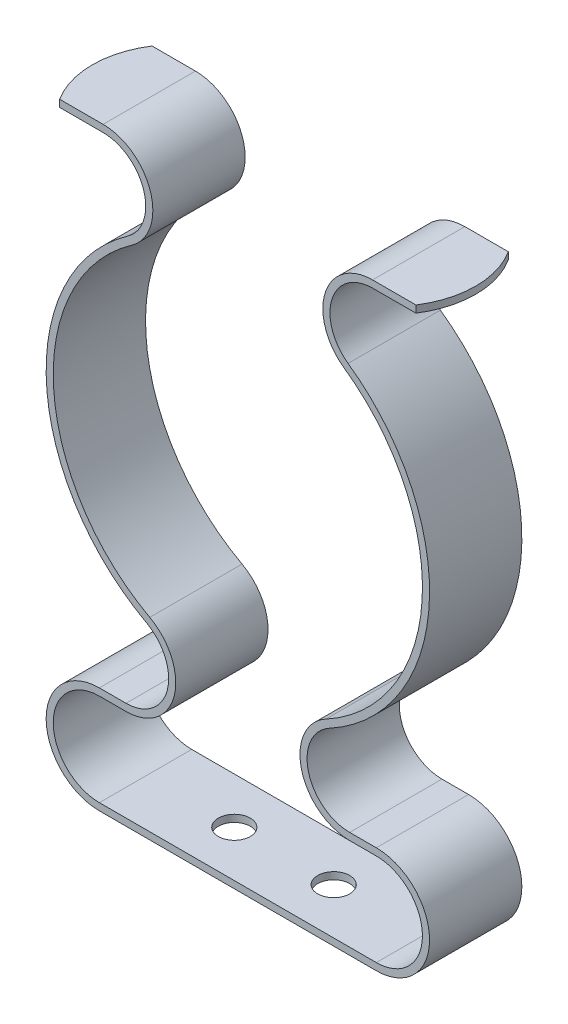
ISO-10303-21;
HEADER;
FILE_DESCRIPTION(('STEP AP214'),'2;1');
FILE_NAME('part.step','',(''),(''),'','','');
FILE_SCHEMA(('AUTOMOTIVE_DESIGN { 1 0 10303 214 1 1 1 1 }'));
ENDSEC;
DATA;
#1=APPLICATION_CONTEXT('core data for automotive mechanical design processes');
#2=APPLICATION_PROTOCOL_DEFINITION('international standard','automotive_design',2000,#1);
#3=PRODUCT_CONTEXT('',#1,'mechanical');
#4=PRODUCT('Part','Part','',(#3));
#5=PRODUCT_RELATED_PRODUCT_CATEGORY('part','',(#4));
#6=PRODUCT_DEFINITION_FORMATION('','',#4);
#7=PRODUCT_DEFINITION_CONTEXT('part definition',#1,'design');
#8=PRODUCT_DEFINITION('design','',#6,#7);
#9=PRODUCT_DEFINITION_SHAPE('','',#8);
#10=(LENGTH_UNIT() NAMED_UNIT(*) SI_UNIT(.MILLI.,.METRE.));
#11=(NAMED_UNIT(*) PLANE_ANGLE_UNIT() SI_UNIT($,.RADIAN.));
#12=(NAMED_UNIT(*) SI_UNIT($,.STERADIAN.) SOLID_ANGLE_UNIT());
#13=UNCERTAINTY_MEASURE_WITH_UNIT(LENGTH_MEASURE(1.E-05),#10,'distance_accuracy_value','');
#14=(GEOMETRIC_REPRESENTATION_CONTEXT(3) GLOBAL_UNCERTAINTY_ASSIGNED_CONTEXT((#13)) GLOBAL_UNIT_ASSIGNED_CONTEXT((#10,
#11,#12)) REPRESENTATION_CONTEXT('',''));
#15=CARTESIAN_POINT('',(0.,0.,0.));
#16=DIRECTION('',(0.,0.,1.));
#17=DIRECTION('',(1.,0.,0.));
#18=AXIS2_PLACEMENT_3D('',#15,#16,#17);
#19=CARTESIAN_POINT('',(-7.,-50.,0.));
#20=DIRECTION('',(0.,-1.,0.));
#21=DIRECTION('',(-1.,0.,0.));
#22=AXIS2_PLACEMENT_3D('',#19,#20,#21);
#23=CYLINDRICAL_SURFACE('',#22,2.25);
#24=CARTESIAN_POINT('',(-7.,-49.,0.));
#25=DIRECTION('',(0.,-1.,0.));
#26=DIRECTION('',(-1.,0.,0.));
#27=AXIS2_PLACEMENT_3D('',#24,#25,#26);
#28=CIRCLE('',#27,2.25);
#29=CARTESIAN_POINT('',(-4.75,-49.,0.));
#30=VERTEX_POINT('',#29);
#31=EDGE_CURVE('E34',#30,#30,#28,.T.);
#32=ORIENTED_EDGE('',*,*,#31,.F.);
#33=EDGE_LOOP('',(#32));
#34=FACE_BOUND('',#33,.T.);
#35=CARTESIAN_POINT('',(-7.,-50.,0.));
#36=DIRECTION('',(0.,1.,0.));
#37=DIRECTION('',(-1.,0.,0.));
#38=AXIS2_PLACEMENT_3D('',#35,#36,#37);
#39=CIRCLE('',#38,2.25);
#40=CARTESIAN_POINT('',(-4.75,-50.,0.));
#41=VERTEX_POINT('',#40);
#42=EDGE_CURVE('E266',#41,#41,#39,.T.);
#43=ORIENTED_EDGE('',*,*,#42,.F.);
#44=EDGE_LOOP('',(#43));
#45=FACE_BOUND('',#44,.T.);
#46=ADVANCED_FACE('F17',(#34,#45),#23,.F.);
#47=CARTESIAN_POINT('',(7.,-50.,0.));
#48=DIRECTION('',(0.,-1.,0.));
#49=DIRECTION('',(-1.,0.,0.));
#50=AXIS2_PLACEMENT_3D('',#47,#48,#49);
#51=CYLINDRICAL_SURFACE('',#50,2.25);
#52=CARTESIAN_POINT('',(7.,-49.,0.));
#53=DIRECTION('',(0.,-1.,0.));
#54=DIRECTION('',(-1.,0.,0.));
#55=AXIS2_PLACEMENT_3D('',#52,#53,#54);
#56=CIRCLE('',#55,2.25);
#57=CARTESIAN_POINT('',(9.25,-49.,0.));
#58=VERTEX_POINT('',#57);
#59=EDGE_CURVE('E351',#58,#58,#56,.T.);
#60=ORIENTED_EDGE('',*,*,#59,.F.);
#61=EDGE_LOOP('',(#60));
#62=FACE_BOUND('',#61,.T.);
#63=CARTESIAN_POINT('',(7.,-50.,0.));
#64=DIRECTION('',(0.,1.,0.));
#65=DIRECTION('',(-1.,0.,0.));
#66=AXIS2_PLACEMENT_3D('',#63,#64,#65);
#67=CIRCLE('',#66,2.25);
#68=CARTESIAN_POINT('',(9.25,-50.,0.));
#69=VERTEX_POINT('',#68);
#70=EDGE_CURVE('E263',#69,#69,#67,.T.);
#71=ORIENTED_EDGE('',*,*,#70,.F.);
#72=EDGE_LOOP('',(#71));
#73=FACE_BOUND('',#72,.T.);
#74=ADVANCED_FACE('F836',(#62,#73),#51,.F.);
#75=CARTESIAN_POINT('',(-15.,34.,0.));
#76=DIRECTION('',(0.,-1.,0.));
#77=DIRECTION('',(0.,0.,1.));
#78=AXIS2_PLACEMENT_3D('',#75,#76,#77);
#79=CYLINDRICAL_SURFACE('',#78,12.);
#80=DIRECTION('',(0.,1.,0.));
#81=VECTOR('',#80,1.);
#82=CARTESIAN_POINT('',(-25.087120500916,34.,-6.5));
#83=LINE('',#82,#81);
#84=CARTESIAN_POINT('',(-25.087120500916,33.,-6.5));
#85=VERTEX_POINT('',#84);
#86=CARTESIAN_POINT('',(-25.087120500916,34.,-6.5));
#87=VERTEX_POINT('',#86);
#88=EDGE_CURVE('E486',#85,#87,#83,.T.);
#89=ORIENTED_EDGE('',*,*,#88,.F.);
#90=CARTESIAN_POINT('',(-15.,33.,0.));
#91=DIRECTION('',(0.,-1.,0.));
#92=DIRECTION('',(0.,0.,1.));
#93=AXIS2_PLACEMENT_3D('',#90,#91,#92);
#94=CIRCLE('',#93,12.);
#95=CARTESIAN_POINT('',(-25.087120500916,33.,6.5));
#96=VERTEX_POINT('',#95);
#97=EDGE_CURVE('E389',#96,#85,#94,.T.);
#98=ORIENTED_EDGE('',*,*,#97,.F.);
#99=DIRECTION('',(0.,-1.,0.));
#100=VECTOR('',#99,1.);
#101=CARTESIAN_POINT('',(-25.087120500916,34.,6.5));
#102=LINE('',#101,#100);
#103=CARTESIAN_POINT('',(-25.087120500916,34.,6.5));
#104=VERTEX_POINT('',#103);
#105=EDGE_CURVE('E11',#104,#96,#102,.T.);
#106=ORIENTED_EDGE('',*,*,#105,.F.);
#107=CARTESIAN_POINT('',(-15.,34.,0.));
#108=DIRECTION('',(0.,1.,0.));
#109=DIRECTION('',(0.,0.,1.));
#110=AXIS2_PLACEMENT_3D('',#107,#108,#109);
#111=CIRCLE('',#110,12.);
#112=EDGE_CURVE('E230',#87,#104,#111,.T.);
#113=ORIENTED_EDGE('',*,*,#112,.F.);
#114=EDGE_LOOP('',(#89,#98,#106,#113));
#115=FACE_BOUND('',#114,.T.);
#116=ADVANCED_FACE('F606',(#115),#79,.T.);
#117=CARTESIAN_POINT('',(0.,-13.1659713817078,6.5));
#118=DIRECTION('',(0.,0.,1.));
#119=DIRECTION('',(1.,0.,0.));
#120=AXIS2_PLACEMENT_3D('',#117,#118,#119);
#121=PLANE('',#120);
#122=ORIENTED_EDGE('',*,*,#105,.T.);
#123=DIRECTION('',(-1.,0.,0.));
#124=VECTOR('',#123,1.);
#125=CARTESIAN_POINT('',(-27.1,33.,6.5));
#126=LINE('',#125,#124);
#127=CARTESIAN_POINT('',(-18.97366596101,33.,6.5));
#128=VERTEX_POINT('',#127);
#129=EDGE_CURVE('E427',#128,#96,#126,.T.);
#130=ORIENTED_EDGE('',*,*,#129,.F.);
#131=CARTESIAN_POINT('',(-18.9736659610105,27.,6.5));
#132=DIRECTION('',(0.,0.,1.));
#133=DIRECTION('',(-0.574959574576072,0.818181818181816,0.));
#134=AXIS2_PLACEMENT_3D('',#131,#132,#133);
#135=CIRCLE('',#134,6.);
#136=CARTESIAN_POINT('',(-15.523908513554,22.090909090909,6.5));
#137=VERTEX_POINT('',#136);
#138=EDGE_CURVE('E268',#137,#128,#135,.T.);
#139=ORIENTED_EDGE('',*,*,#138,.F.);
#140=CARTESIAN_POINT('',(6.99440505513849E-13,-1.35447209004269E-13,6.5));
#141=DIRECTION('',(0.,0.,-1.));
#142=DIRECTION('',(-0.574959574576089,0.818181818181804,0.));
#143=AXIS2_PLACEMENT_3D('',#140,#141,#142);
#144=CIRCLE('',#143,27.0000000000005);
#145=CARTESIAN_POINT('',(-12.884740157474,-23.727272727273,6.5));
#146=VERTEX_POINT('',#145);
#147=EDGE_CURVE('E293',#146,#137,#144,.T.);
#148=ORIENTED_EDGE('',*,*,#147,.F.);
#149=CARTESIAN_POINT('',(-15.7480157480234,-29.,6.5));
#150=DIRECTION('',(0.,0.,1.));
#151=DIRECTION('',(0.,1.,0.));
#152=AXIS2_PLACEMENT_3D('',#149,#150,#151);
#153=CIRCLE('',#152,5.9999999999998);
#154=CARTESIAN_POINT('',(-15.748015748024,-35.,6.5));
#155=VERTEX_POINT('',#154);
#156=EDGE_CURVE('E412',#155,#146,#153,.T.);
#157=ORIENTED_EDGE('',*,*,#156,.F.);
#158=DIRECTION('',(1.,0.,0.));
#159=VECTOR('',#158,1.);
#160=CARTESIAN_POINT('',(-15.748015748024,-35.,6.5));
#161=LINE('',#160,#159);
#162=CARTESIAN_POINT('',(-19.5,-35.,6.5));
#163=VERTEX_POINT('',#162);
#164=EDGE_CURVE('E262',#163,#155,#161,.T.);
#165=ORIENTED_EDGE('',*,*,#164,.F.);
#166=CARTESIAN_POINT('',(-19.5,-42.5,6.5));
#167=DIRECTION('',(0.,0.,-1.));
#168=DIRECTION('',(0.,1.,0.));
#169=AXIS2_PLACEMENT_3D('',#166,#167,#168);
#170=CIRCLE('',#169,7.5);
#171=CARTESIAN_POINT('',(-19.5,-50.,6.5));
#172=VERTEX_POINT('',#171);
#173=EDGE_CURVE('E307',#172,#163,#170,.T.);
#174=ORIENTED_EDGE('',*,*,#173,.F.);
#175=DIRECTION('',(-1.,0.,0.));
#176=VECTOR('',#175,1.);
#177=CARTESIAN_POINT('',(-19.5,-50.,6.5));
#178=LINE('',#177,#176);
#179=CARTESIAN_POINT('',(19.5,-50.,6.5));
#180=VERTEX_POINT('',#179);
#181=EDGE_CURVE('E267',#180,#172,#178,.T.);
#182=ORIENTED_EDGE('',*,*,#181,.F.);
#183=CARTESIAN_POINT('',(19.5,-42.5,6.5));
#184=DIRECTION('',(0.,0.,-1.));
#185=DIRECTION('',(0.,-1.,0.));
#186=AXIS2_PLACEMENT_3D('',#183,#184,#185);
#187=CIRCLE('',#186,7.5);
#188=CARTESIAN_POINT('',(19.5,-35.,6.5));
#189=VERTEX_POINT('',#188);
#190=EDGE_CURVE('E276',#189,#180,#187,.T.);
#191=ORIENTED_EDGE('',*,*,#190,.F.);
#192=DIRECTION('',(1.,0.,0.));
#193=VECTOR('',#192,1.);
#194=CARTESIAN_POINT('',(19.5,-35.,6.5));
#195=LINE('',#194,#193);
#196=CARTESIAN_POINT('',(15.748015748024,-35.,6.5));
#197=VERTEX_POINT('',#196);
#198=EDGE_CURVE('E283',#197,#189,#195,.T.);
#199=ORIENTED_EDGE('',*,*,#198,.F.);
#200=CARTESIAN_POINT('',(15.7480157480234,-29.,6.5));
#201=DIRECTION('',(0.,0.,1.));
#202=DIRECTION('',(0.477212598424925,-0.878787878787897,0.));
#203=AXIS2_PLACEMENT_3D('',#200,#201,#202);
#204=CIRCLE('',#203,5.9999999999998);
#205=CARTESIAN_POINT('',(12.884740157474,-23.727272727273,6.5));
#206=VERTEX_POINT('',#205);
#207=EDGE_CURVE('E310',#206,#197,#204,.T.);
#208=ORIENTED_EDGE('',*,*,#207,.F.);
#209=CARTESIAN_POINT('',(-7.01660951563099E-13,-1.33226762955019E-13,6.5));
#210=DIRECTION('',(0.,0.,-1.));
#211=DIRECTION('',(0.47721259842498,-0.878787878787867,0.));
#212=AXIS2_PLACEMENT_3D('',#209,#210,#211);
#213=CIRCLE('',#212,27.0000000000006);
#214=CARTESIAN_POINT('',(15.523908513554,22.090909090909,6.5));
#215=VERTEX_POINT('',#214);
#216=EDGE_CURVE('E314',#215,#206,#213,.T.);
#217=ORIENTED_EDGE('',*,*,#216,.F.);
#218=CARTESIAN_POINT('',(18.9736659610105,27.,6.5));
#219=DIRECTION('',(0.,0.,1.));
#220=DIRECTION('',(0.,-1.,0.));
#221=AXIS2_PLACEMENT_3D('',#218,#219,#220);
#222=CIRCLE('',#221,6.);
#223=CARTESIAN_POINT('',(18.97366596101,33.,6.5));
#224=VERTEX_POINT('',#223);
#225=EDGE_CURVE('E532',#224,#215,#222,.T.);
#226=ORIENTED_EDGE('',*,*,#225,.F.);
#227=DIRECTION('',(-1.,0.,0.));
#228=VECTOR('',#227,1.);
#229=CARTESIAN_POINT('',(18.97366596101,33.,6.5));
#230=LINE('',#229,#228);
#231=CARTESIAN_POINT('',(25.087120500916,33.,6.5));
#232=VERTEX_POINT('',#231);
#233=EDGE_CURVE('E437',#232,#224,#230,.T.);
#234=ORIENTED_EDGE('',*,*,#233,.F.);
#235=DIRECTION('',(0.,1.,0.));
#236=VECTOR('',#235,1.);
#237=CARTESIAN_POINT('',(25.087120500916,34.,6.5));
#238=LINE('',#237,#236);
#239=CARTESIAN_POINT('',(25.087120500916,34.,6.5));
#240=VERTEX_POINT('',#239);
#241=EDGE_CURVE('E27',#232,#240,#238,.T.);
#242=ORIENTED_EDGE('',*,*,#241,.T.);
#243=DIRECTION('',(1.,0.,0.));
#244=VECTOR('',#243,1.);
#245=CARTESIAN_POINT('',(27.1,34.,6.5));
#246=LINE('',#245,#244);
#247=CARTESIAN_POINT('',(18.97366596101,34.,6.5));
#248=VERTEX_POINT('',#247);
#249=EDGE_CURVE('E482',#248,#240,#246,.T.);
#250=ORIENTED_EDGE('',*,*,#249,.F.);
#251=CARTESIAN_POINT('',(18.9736659610103,27.,6.5));
#252=DIRECTION('',(0.,0.,-1.));
#253=DIRECTION('',(0.,1.,0.));
#254=AXIS2_PLACEMENT_3D('',#251,#252,#253);
#255=CIRCLE('',#254,7.);
#256=CARTESIAN_POINT('',(14.948948938978,21.272727272727,6.5));
#257=VERTEX_POINT('',#256);
#258=EDGE_CURVE('E301',#257,#248,#255,.T.);
#259=ORIENTED_EDGE('',*,*,#258,.F.);
#260=CARTESIAN_POINT('',(8.94839757847876E-13,-2.1316282072803E-13,6.5));
#261=DIRECTION('',(0.,0.,1.));
#262=DIRECTION('',(-0.477212598424935,0.878787878787891,0.));
#263=AXIS2_PLACEMENT_3D('',#260,#261,#262);
#264=CIRCLE('',#263,25.9999999999996);
#265=CARTESIAN_POINT('',(12.407527559049,-22.848484848485,6.5));
#266=VERTEX_POINT('',#265);
#267=EDGE_CURVE('E284',#266,#257,#264,.T.);
#268=ORIENTED_EDGE('',*,*,#267,.F.);
#269=CARTESIAN_POINT('',(15.7480157480234,-29.,6.5));
#270=DIRECTION('',(0.,0.,-1.));
#271=DIRECTION('',(-0.47721259842493,0.878787878787894,0.));
#272=AXIS2_PLACEMENT_3D('',#269,#270,#271);
#273=CIRCLE('',#272,6.99999999999986);
#274=CARTESIAN_POINT('',(15.748015748024,-36.,6.5));
#275=VERTEX_POINT('',#274);
#276=EDGE_CURVE('E256',#275,#266,#273,.T.);
#277=ORIENTED_EDGE('',*,*,#276,.F.);
#278=DIRECTION('',(-1.,0.,0.));
#279=VECTOR('',#278,1.);
#280=CARTESIAN_POINT('',(15.748015748024,-36.,6.5));
#281=LINE('',#280,#279);
#282=CARTESIAN_POINT('',(19.5,-36.,6.5));
#283=VERTEX_POINT('',#282);
#284=EDGE_CURVE('E366',#283,#275,#281,.T.);
#285=ORIENTED_EDGE('',*,*,#284,.F.);
#286=CARTESIAN_POINT('',(19.5,-42.5,6.5));
#287=DIRECTION('',(0.,0.,1.));
#288=DIRECTION('',(0.,1.,0.));
#289=AXIS2_PLACEMENT_3D('',#286,#287,#288);
#290=CIRCLE('',#289,6.5);
#291=CARTESIAN_POINT('',(19.5,-49.,6.5));
#292=VERTEX_POINT('',#291);
#293=EDGE_CURVE('E398',#292,#283,#290,.T.);
#294=ORIENTED_EDGE('',*,*,#293,.F.);
#295=DIRECTION('',(1.,0.,0.));
#296=VECTOR('',#295,1.);
#297=CARTESIAN_POINT('',(19.5,-49.,6.5));
#298=LINE('',#297,#296);
#299=CARTESIAN_POINT('',(-19.5,-49.,6.5));
#300=VERTEX_POINT('',#299);
#301=EDGE_CURVE('E347',#300,#292,#298,.T.);
#302=ORIENTED_EDGE('',*,*,#301,.F.);
#303=CARTESIAN_POINT('',(-19.5,-42.5,6.5));
#304=DIRECTION('',(0.,0.,1.));
#305=DIRECTION('',(0.,-1.,0.));
#306=AXIS2_PLACEMENT_3D('',#303,#304,#305);
#307=CIRCLE('',#306,6.5);
#308=CARTESIAN_POINT('',(-19.5,-36.,6.5));
#309=VERTEX_POINT('',#308);
#310=EDGE_CURVE('E341',#309,#300,#307,.T.);
#311=ORIENTED_EDGE('',*,*,#310,.F.);
#312=DIRECTION('',(-1.,0.,0.));
#313=VECTOR('',#312,1.);
#314=CARTESIAN_POINT('',(-19.5,-36.,6.5));
#315=LINE('',#314,#313);
#316=CARTESIAN_POINT('',(-15.748015748024,-36.,6.5));
#317=VERTEX_POINT('',#316);
#318=EDGE_CURVE('E329',#317,#309,#315,.T.);
#319=ORIENTED_EDGE('',*,*,#318,.F.);
#320=CARTESIAN_POINT('',(-15.7480157480234,-29.,6.5));
#321=DIRECTION('',(0.,0.,-1.));
#322=DIRECTION('',(0.,-1.,0.));
#323=AXIS2_PLACEMENT_3D('',#320,#321,#322);
#324=CIRCLE('',#323,6.99999999999986);
#325=CARTESIAN_POINT('',(-12.407527559049,-22.848484848485,6.5));
#326=VERTEX_POINT('',#325);
#327=EDGE_CURVE('E325',#326,#317,#324,.T.);
#328=ORIENTED_EDGE('',*,*,#327,.F.);
#329=CARTESIAN_POINT('',(-8.92619311798626E-13,-2.18713935851156E-13,6.5));
#330=DIRECTION('',(0.,0.,1.));
#331=DIRECTION('',(0.574959574576052,-0.81818181818183,0.));
#332=AXIS2_PLACEMENT_3D('',#329,#330,#331);
#333=CIRCLE('',#332,25.9999999999996);
#334=CARTESIAN_POINT('',(-14.948948938978,21.272727272727,6.5));
#335=VERTEX_POINT('',#334);
#336=EDGE_CURVE('E216',#335,#326,#333,.T.);
#337=ORIENTED_EDGE('',*,*,#336,.F.);
#338=CARTESIAN_POINT('',(-18.9736659610103,27.,6.5));
#339=DIRECTION('',(0.,0.,-1.));
#340=DIRECTION('',(0.574959574576038,-0.81818181818184,0.));
#341=AXIS2_PLACEMENT_3D('',#338,#339,#340);
#342=CIRCLE('',#341,7.);
#343=CARTESIAN_POINT('',(-18.97366596101,34.,6.5));
#344=VERTEX_POINT('',#343);
#345=EDGE_CURVE('E210',#344,#335,#342,.T.);
#346=ORIENTED_EDGE('',*,*,#345,.F.);
#347=DIRECTION('',(1.,0.,0.));
#348=VECTOR('',#347,1.);
#349=CARTESIAN_POINT('',(-18.97366596101,34.,6.5));
#350=LINE('',#349,#348);
#351=EDGE_CURVE('E213',#104,#344,#350,.T.);
#352=ORIENTED_EDGE('',*,*,#351,.F.);
#353=EDGE_LOOP('',(#122,#130,#139,#148,#157,#165,#174,#182,#191,#199,#208,#217,#226,#234,#242,
#250,#259,#268,#277,#285,#294,#302,#311,#319,#328,#337,#346,#352));
#354=FACE_BOUND('',#353,.T.);
#355=ADVANCED_FACE('F212',(#354),#121,.T.);
#356=CARTESIAN_POINT('',(-18.97366596101,33.,0.));
#357=DIRECTION('',(0.,-1.,0.));
#358=DIRECTION('',(0.,0.,-1.));
#359=AXIS2_PLACEMENT_3D('',#356,#357,#358);
#360=PLANE('',#359);
#361=ORIENTED_EDGE('',*,*,#97,.T.);
#362=DIRECTION('',(1.,0.,0.));
#363=VECTOR('',#362,1.);
#364=CARTESIAN_POINT('',(-27.1,33.,-6.5));
#365=LINE('',#364,#363);
#366=CARTESIAN_POINT('',(-18.97366596101,33.,-6.5));
#367=VERTEX_POINT('',#366);
#368=EDGE_CURVE('E385',#85,#367,#365,.T.);
#369=ORIENTED_EDGE('',*,*,#368,.T.);
#370=DIRECTION('',(0.,0.,1.));
#371=VECTOR('',#370,1.);
#372=CARTESIAN_POINT('',(-18.97366596101,33.,0.));
#373=LINE('',#372,#371);
#374=EDGE_CURVE('E390',#367,#128,#373,.T.);
#375=ORIENTED_EDGE('',*,*,#374,.T.);
#376=ORIENTED_EDGE('',*,*,#129,.T.);
#377=EDGE_LOOP('',(#361,#369,#375,#376));
#378=FACE_BOUND('',#377,.T.);
#379=ADVANCED_FACE('F608',(#378),#360,.T.);
#380=CARTESIAN_POINT('',(15.,34.,0.));
#381=DIRECTION('',(0.,-1.,0.));
#382=DIRECTION('',(0.,0.,-1.));
#383=AXIS2_PLACEMENT_3D('',#380,#381,#382);
#384=CYLINDRICAL_SURFACE('',#383,12.);
#385=DIRECTION('',(0.,-1.,0.));
#386=VECTOR('',#385,1.);
#387=CARTESIAN_POINT('',(25.087120500916,34.,-6.5));
#388=LINE('',#387,#386);
#389=CARTESIAN_POINT('',(25.087120500916,34.,-6.5));
#390=VERTEX_POINT('',#389);
#391=CARTESIAN_POINT('',(25.087120500916,33.,-6.5));
#392=VERTEX_POINT('',#391);
#393=EDGE_CURVE('E258',#390,#392,#388,.T.);
#394=ORIENTED_EDGE('',*,*,#393,.F.);
#395=CARTESIAN_POINT('',(15.,34.,0.));
#396=DIRECTION('',(0.,1.,0.));
#397=DIRECTION('',(0.,0.,-1.));
#398=AXIS2_PLACEMENT_3D('',#395,#396,#397);
#399=CIRCLE('',#398,12.);
#400=EDGE_CURVE('E364',#240,#390,#399,.T.);
#401=ORIENTED_EDGE('',*,*,#400,.F.);
#402=ORIENTED_EDGE('',*,*,#241,.F.);
#403=CARTESIAN_POINT('',(15.,33.,0.));
#404=DIRECTION('',(0.,-1.,0.));
#405=DIRECTION('',(0.,0.,-1.));
#406=AXIS2_PLACEMENT_3D('',#403,#404,#405);
#407=CIRCLE('',#406,12.);
#408=EDGE_CURVE('E359',#392,#232,#407,.T.);
#409=ORIENTED_EDGE('',*,*,#408,.F.);
#410=EDGE_LOOP('',(#394,#401,#402,#409));
#411=FACE_BOUND('',#410,.T.);
#412=ADVANCED_FACE('F564',(#411),#384,.T.);
#413=CARTESIAN_POINT('',(18.97366596101,34.,0.));
#414=DIRECTION('',(0.,1.,0.));
#415=DIRECTION('',(0.,0.,1.));
#416=AXIS2_PLACEMENT_3D('',#413,#414,#415);
#417=PLANE('',#416);
#418=ORIENTED_EDGE('',*,*,#400,.T.);
#419=DIRECTION('',(-1.,0.,0.));
#420=VECTOR('',#419,1.);
#421=CARTESIAN_POINT('',(27.1,34.,-6.5));
#422=LINE('',#421,#420);
#423=CARTESIAN_POINT('',(18.97366596101,34.,-6.5));
#424=VERTEX_POINT('',#423);
#425=EDGE_CURVE('E360',#390,#424,#422,.T.);
#426=ORIENTED_EDGE('',*,*,#425,.T.);
#427=DIRECTION('',(0.,0.,1.));
#428=VECTOR('',#427,1.);
#429=CARTESIAN_POINT('',(18.97366596101,34.,0.));
#430=LINE('',#429,#428);
#431=EDGE_CURVE('E365',#424,#248,#430,.T.);
#432=ORIENTED_EDGE('',*,*,#431,.T.);
#433=ORIENTED_EDGE('',*,*,#249,.T.);
#434=EDGE_LOOP('',(#418,#426,#432,#433));
#435=FACE_BOUND('',#434,.T.);
#436=ADVANCED_FACE('F567',(#435),#417,.T.);
#437=CARTESIAN_POINT('',(0.,-13.1659713817078,-6.5));
#438=DIRECTION('',(0.,0.,1.));
#439=DIRECTION('',(1.,0.,0.));
#440=AXIS2_PLACEMENT_3D('',#437,#438,#439);
#441=PLANE('',#440);
#442=ORIENTED_EDGE('',*,*,#88,.T.);
#443=DIRECTION('',(-1.,0.,0.));
#444=VECTOR('',#443,1.);
#445=CARTESIAN_POINT('',(-18.97366596101,34.,-6.5));
#446=LINE('',#445,#444);
#447=CARTESIAN_POINT('',(-18.97366596101,34.,-6.5));
#448=VERTEX_POINT('',#447);
#449=EDGE_CURVE('E222',#448,#87,#446,.T.);
#450=ORIENTED_EDGE('',*,*,#449,.F.);
#451=CARTESIAN_POINT('',(-18.9736659610103,27.,-6.5));
#452=DIRECTION('',(0.,0.,1.));
#453=DIRECTION('',(0.574959574576038,-0.81818181818184,0.));
#454=AXIS2_PLACEMENT_3D('',#451,#452,#453);
#455=CIRCLE('',#454,7.);
#456=CARTESIAN_POINT('',(-14.948948938978,21.272727272727,-6.5));
#457=VERTEX_POINT('',#456);
#458=EDGE_CURVE('E223',#457,#448,#455,.T.);
#459=ORIENTED_EDGE('',*,*,#458,.F.);
#460=CARTESIAN_POINT('',(-8.92619311798626E-13,-2.18713935851156E-13,-6.5));
#461=DIRECTION('',(0.,0.,-1.));
#462=DIRECTION('',(0.574959574576052,-0.81818181818183,0.));
#463=AXIS2_PLACEMENT_3D('',#460,#461,#462);
#464=CIRCLE('',#463,25.9999999999996);
#465=CARTESIAN_POINT('',(-12.407527559049,-22.848484848485,-6.5));
#466=VERTEX_POINT('',#465);
#467=EDGE_CURVE('E246',#466,#457,#464,.T.);
#468=ORIENTED_EDGE('',*,*,#467,.F.);
#469=CARTESIAN_POINT('',(-15.7480157480234,-29.,-6.5));
#470=DIRECTION('',(0.,0.,1.));
#471=DIRECTION('',(0.,-1.,0.));
#472=AXIS2_PLACEMENT_3D('',#469,#470,#471);
#473=CIRCLE('',#472,6.99999999999986);
#474=CARTESIAN_POINT('',(-15.748015748024,-36.,-6.5));
#475=VERTEX_POINT('',#474);
#476=EDGE_CURVE('E118',#475,#466,#473,.T.);
#477=ORIENTED_EDGE('',*,*,#476,.F.);
#478=DIRECTION('',(1.,0.,0.));
#479=VECTOR('',#478,1.);
#480=CARTESIAN_POINT('',(-19.5,-36.,-6.5));
#481=LINE('',#480,#479);
#482=CARTESIAN_POINT('',(-19.5,-36.,-6.5));
#483=VERTEX_POINT('',#482);
#484=EDGE_CURVE('E129',#483,#475,#481,.T.);
#485=ORIENTED_EDGE('',*,*,#484,.F.);
#486=CARTESIAN_POINT('',(-19.5,-42.5,-6.5));
#487=DIRECTION('',(0.,0.,-1.));
#488=DIRECTION('',(0.,-1.,0.));
#489=AXIS2_PLACEMENT_3D('',#486,#487,#488);
#490=CIRCLE('',#489,6.5);
#491=CARTESIAN_POINT('',(-19.5,-49.,-6.5));
#492=VERTEX_POINT('',#491);
#493=EDGE_CURVE('E338',#492,#483,#490,.T.);
#494=ORIENTED_EDGE('',*,*,#493,.F.);
#495=DIRECTION('',(-1.,0.,0.));
#496=VECTOR('',#495,1.);
#497=CARTESIAN_POINT('',(19.5,-49.,-6.5));
#498=LINE('',#497,#496);
#499=CARTESIAN_POINT('',(19.5,-49.,-6.5));
#500=VERTEX_POINT('',#499);
#501=EDGE_CURVE('E352',#500,#492,#498,.T.);
#502=ORIENTED_EDGE('',*,*,#501,.F.);
#503=CARTESIAN_POINT('',(19.5,-42.5,-6.5));
#504=DIRECTION('',(0.,0.,-1.));
#505=DIRECTION('',(0.,1.,0.));
#506=AXIS2_PLACEMENT_3D('',#503,#504,#505);
#507=CIRCLE('',#506,6.5);
#508=CARTESIAN_POINT('',(19.5,-36.,-6.5));
#509=VERTEX_POINT('',#508);
#510=EDGE_CURVE('E420',#509,#500,#507,.T.);
#511=ORIENTED_EDGE('',*,*,#510,.F.);
#512=DIRECTION('',(1.,0.,0.));
#513=VECTOR('',#512,1.);
#514=CARTESIAN_POINT('',(15.748015748024,-36.,-6.5));
#515=LINE('',#514,#513);
#516=CARTESIAN_POINT('',(15.748015748024,-36.,-6.5));
#517=VERTEX_POINT('',#516);
#518=EDGE_CURVE('E255',#517,#509,#515,.T.);
#519=ORIENTED_EDGE('',*,*,#518,.F.);
#520=CARTESIAN_POINT('',(15.7480157480234,-29.,-6.5));
#521=DIRECTION('',(0.,0.,1.));
#522=DIRECTION('',(-0.47721259842493,0.878787878787894,0.));
#523=AXIS2_PLACEMENT_3D('',#520,#521,#522);
#524=CIRCLE('',#523,6.99999999999986);
#525=CARTESIAN_POINT('',(12.407527559049,-22.848484848485,-6.5));
#526=VERTEX_POINT('',#525);
#527=EDGE_CURVE('E343',#526,#517,#524,.T.);
#528=ORIENTED_EDGE('',*,*,#527,.F.);
#529=CARTESIAN_POINT('',(8.94839757847876E-13,-2.1316282072803E-13,-6.5));
#530=DIRECTION('',(0.,0.,-1.));
#531=DIRECTION('',(-0.477212598424935,0.878787878787891,0.));
#532=AXIS2_PLACEMENT_3D('',#529,#530,#531);
#533=CIRCLE('',#532,25.9999999999996);
#534=CARTESIAN_POINT('',(14.948948938978,21.272727272727,-6.5));
#535=VERTEX_POINT('',#534);
#536=EDGE_CURVE('E289',#535,#526,#533,.T.);
#537=ORIENTED_EDGE('',*,*,#536,.F.);
#538=CARTESIAN_POINT('',(18.9736659610103,27.,-6.5));
#539=DIRECTION('',(0.,0.,1.));
#540=DIRECTION('',(0.,1.,0.));
#541=AXIS2_PLACEMENT_3D('',#538,#539,#540);
#542=CIRCLE('',#541,7.);
#543=EDGE_CURVE('E322',#424,#535,#542,.T.);
#544=ORIENTED_EDGE('',*,*,#543,.F.);
#545=ORIENTED_EDGE('',*,*,#425,.F.);
#546=ORIENTED_EDGE('',*,*,#393,.T.);
#547=DIRECTION('',(1.,0.,0.));
#548=VECTOR('',#547,1.);
#549=CARTESIAN_POINT('',(18.97366596101,33.,-6.5));
#550=LINE('',#549,#548);
#551=CARTESIAN_POINT('',(18.97366596101,33.,-6.5));
#552=VERTEX_POINT('',#551);
#553=EDGE_CURVE('E522',#552,#392,#550,.T.);
#554=ORIENTED_EDGE('',*,*,#553,.F.);
#555=CARTESIAN_POINT('',(18.9736659610105,27.,-6.5));
#556=DIRECTION('',(0.,0.,-1.));
#557=DIRECTION('',(0.,-1.,0.));
#558=AXIS2_PLACEMENT_3D('',#555,#556,#557);
#559=CIRCLE('',#558,6.);
#560=CARTESIAN_POINT('',(15.523908513554,22.090909090909,-6.5));
#561=VERTEX_POINT('',#560);
#562=EDGE_CURVE('E499',#561,#552,#559,.T.);
#563=ORIENTED_EDGE('',*,*,#562,.F.);
#564=CARTESIAN_POINT('',(-7.01660951563099E-13,-1.33226762955019E-13,-6.5));
#565=DIRECTION('',(0.,0.,1.));
#566=DIRECTION('',(0.47721259842498,-0.878787878787867,0.));
#567=AXIS2_PLACEMENT_3D('',#564,#565,#566);
#568=CIRCLE('',#567,27.0000000000006);
#569=CARTESIAN_POINT('',(12.884740157474,-23.727272727273,-6.5));
#570=VERTEX_POINT('',#569);
#571=EDGE_CURVE('E319',#570,#561,#568,.T.);
#572=ORIENTED_EDGE('',*,*,#571,.F.);
#573=CARTESIAN_POINT('',(15.7480157480234,-29.,-6.5));
#574=DIRECTION('',(0.,0.,-1.));
#575=DIRECTION('',(0.477212598424925,-0.878787878787897,0.));
#576=AXIS2_PLACEMENT_3D('',#573,#574,#575);
#577=CIRCLE('',#576,5.9999999999998);
#578=CARTESIAN_POINT('',(15.748015748024,-35.,-6.5));
#579=VERTEX_POINT('',#578);
#580=EDGE_CURVE('E282',#579,#570,#577,.T.);
#581=ORIENTED_EDGE('',*,*,#580,.F.);
#582=DIRECTION('',(-1.,0.,0.));
#583=VECTOR('',#582,1.);
#584=CARTESIAN_POINT('',(19.5,-35.,-6.5));
#585=LINE('',#584,#583);
#586=CARTESIAN_POINT('',(19.5,-35.,-6.5));
#587=VERTEX_POINT('',#586);
#588=EDGE_CURVE('E431',#587,#579,#585,.T.);
#589=ORIENTED_EDGE('',*,*,#588,.F.);
#590=CARTESIAN_POINT('',(19.5,-42.5,-6.5));
#591=DIRECTION('',(0.,0.,1.));
#592=DIRECTION('',(0.,-1.,0.));
#593=AXIS2_PLACEMENT_3D('',#590,#591,#592);
#594=CIRCLE('',#593,7.5);
#595=CARTESIAN_POINT('',(19.5,-50.,-6.5));
#596=VERTEX_POINT('',#595);
#597=EDGE_CURVE('E273',#596,#587,#594,.T.);
#598=ORIENTED_EDGE('',*,*,#597,.F.);
#599=DIRECTION('',(1.,0.,0.));
#600=VECTOR('',#599,1.);
#601=CARTESIAN_POINT('',(-19.5,-50.,-6.5));
#602=LINE('',#601,#600);
#603=CARTESIAN_POINT('',(-19.5,-50.,-6.5));
#604=VERTEX_POINT('',#603);
#605=EDGE_CURVE('E306',#604,#596,#602,.T.);
#606=ORIENTED_EDGE('',*,*,#605,.F.);
#607=CARTESIAN_POINT('',(-19.5,-42.5,-6.5));
#608=DIRECTION('',(0.,0.,1.));
#609=DIRECTION('',(0.,1.,0.));
#610=AXIS2_PLACEMENT_3D('',#607,#608,#609);
#611=CIRCLE('',#610,7.5);
#612=CARTESIAN_POINT('',(-19.5,-35.,-6.5));
#613=VERTEX_POINT('',#612);
#614=EDGE_CURVE('E375',#613,#604,#611,.T.);
#615=ORIENTED_EDGE('',*,*,#614,.F.);
#616=DIRECTION('',(-1.,0.,0.));
#617=VECTOR('',#616,1.);
#618=CARTESIAN_POINT('',(-15.748015748024,-35.,-6.5));
#619=LINE('',#618,#617);
#620=CARTESIAN_POINT('',(-15.748015748024,-35.,-6.5));
#621=VERTEX_POINT('',#620);
#622=EDGE_CURVE('E259',#621,#613,#619,.T.);
#623=ORIENTED_EDGE('',*,*,#622,.F.);
#624=CARTESIAN_POINT('',(-15.7480157480234,-29.,-6.5));
#625=DIRECTION('',(0.,0.,-1.));
#626=DIRECTION('',(0.,1.,0.));
#627=AXIS2_PLACEMENT_3D('',#624,#625,#626);
#628=CIRCLE('',#627,5.9999999999998);
#629=CARTESIAN_POINT('',(-12.884740157474,-23.727272727273,-6.5));
#630=VERTEX_POINT('',#629);
#631=EDGE_CURVE('E416',#630,#621,#628,.T.);
#632=ORIENTED_EDGE('',*,*,#631,.F.);
#633=CARTESIAN_POINT('',(6.99440505513849E-13,-1.35447209004269E-13,-6.5));
#634=DIRECTION('',(0.,0.,1.));
#635=DIRECTION('',(-0.574959574576089,0.818181818181804,0.));
#636=AXIS2_PLACEMENT_3D('',#633,#634,#635);
#637=CIRCLE('',#636,27.0000000000005);
#638=CARTESIAN_POINT('',(-15.523908513554,22.090909090909,-6.5));
#639=VERTEX_POINT('',#638);
#640=EDGE_CURVE('E290',#639,#630,#637,.T.);
#641=ORIENTED_EDGE('',*,*,#640,.F.);
#642=CARTESIAN_POINT('',(-18.9736659610105,27.,-6.5));
#643=DIRECTION('',(0.,0.,-1.));
#644=DIRECTION('',(-0.574959574576072,0.818181818181816,0.));
#645=AXIS2_PLACEMENT_3D('',#642,#643,#644);
#646=CIRCLE('',#645,6.);
#647=EDGE_CURVE('E272',#367,#639,#646,.T.);
#648=ORIENTED_EDGE('',*,*,#647,.F.);
#649=ORIENTED_EDGE('',*,*,#368,.F.);
#650=EDGE_LOOP('',(#442,#450,#459,#468,#477,#485,#494,#502,#511,#519,#528,#537,#544,#545,#546,
#554,#563,#572,#581,#589,#598,#606,#615,#623,#632,#641,#648,#649));
#651=FACE_BOUND('',#650,.T.);
#652=ADVANCED_FACE('F456',(#651),#441,.F.);
#653=CARTESIAN_POINT('',(-27.1,34.,0.));
#654=DIRECTION('',(0.,1.,0.));
#655=DIRECTION('',(0.,0.,1.));
#656=AXIS2_PLACEMENT_3D('',#653,#654,#655);
#657=PLANE('',#656);
#658=ORIENTED_EDGE('',*,*,#112,.T.);
#659=ORIENTED_EDGE('',*,*,#351,.T.);
#660=DIRECTION('',(0.,0.,1.));
#661=VECTOR('',#660,1.);
#662=CARTESIAN_POINT('',(-18.97366596101,34.,0.));
#663=LINE('',#662,#661);
#664=EDGE_CURVE('E229',#448,#344,#663,.T.);
#665=ORIENTED_EDGE('',*,*,#664,.F.);
#666=ORIENTED_EDGE('',*,*,#449,.T.);
#667=EDGE_LOOP('',(#658,#659,#665,#666));
#668=FACE_BOUND('',#667,.T.);
#669=ADVANCED_FACE('F227',(#668),#657,.T.);
#670=CARTESIAN_POINT('',(-18.9736659610103,27.,0.));
#671=DIRECTION('',(0.,0.,-1.));
#672=DIRECTION('',(0.574959574576038,-0.81818181818184,0.));
#673=AXIS2_PLACEMENT_3D('',#670,#671,#672);
#674=CYLINDRICAL_SURFACE('',#673,7.);
#675=ORIENTED_EDGE('',*,*,#345,.T.);
#676=DIRECTION('',(0.,0.,1.));
#677=VECTOR('',#676,1.);
#678=CARTESIAN_POINT('',(-14.948948938978,21.272727272727,0.));
#679=LINE('',#678,#677);
#680=EDGE_CURVE('E312',#457,#335,#679,.T.);
#681=ORIENTED_EDGE('',*,*,#680,.F.);
#682=ORIENTED_EDGE('',*,*,#458,.T.);
#683=ORIENTED_EDGE('',*,*,#664,.T.);
#684=EDGE_LOOP('',(#675,#681,#682,#683));
#685=FACE_BOUND('',#684,.T.);
#686=ADVANCED_FACE('F234',(#685),#674,.T.);
#687=CARTESIAN_POINT('',(-8.92619311798626E-13,-2.18713935851156E-13,0.));
#688=DIRECTION('',(0.,0.,-1.));
#689=DIRECTION('',(0.574959574576052,-0.81818181818183,0.));
#690=AXIS2_PLACEMENT_3D('',#687,#688,#689);
#691=CYLINDRICAL_SURFACE('',#690,25.9999999999996);
#692=ORIENTED_EDGE('',*,*,#336,.T.);
#693=DIRECTION('',(0.,0.,1.));
#694=VECTOR('',#693,1.);
#695=CARTESIAN_POINT('',(-12.407527559049,-22.848484848485,0.));
#696=LINE('',#695,#694);
#697=EDGE_CURVE('E326',#466,#326,#696,.T.);
#698=ORIENTED_EDGE('',*,*,#697,.F.);
#699=ORIENTED_EDGE('',*,*,#467,.T.);
#700=ORIENTED_EDGE('',*,*,#680,.T.);
#701=EDGE_LOOP('',(#692,#698,#699,#700));
#702=FACE_BOUND('',#701,.T.);
#703=ADVANCED_FACE('F19',(#702),#691,.F.);
#704=CARTESIAN_POINT('',(-15.7480157480234,-29.,0.));
#705=DIRECTION('',(0.,0.,-1.));
#706=DIRECTION('',(0.,-1.,0.));
#707=AXIS2_PLACEMENT_3D('',#704,#705,#706);
#708=CYLINDRICAL_SURFACE('',#707,6.99999999999986);
#709=ORIENTED_EDGE('',*,*,#327,.T.);
#710=DIRECTION('',(0.,0.,1.));
#711=VECTOR('',#710,1.);
#712=CARTESIAN_POINT('',(-15.748015748024,-36.,0.));
#713=LINE('',#712,#711);
#714=EDGE_CURVE('E250',#475,#317,#713,.T.);
#715=ORIENTED_EDGE('',*,*,#714,.F.);
#716=ORIENTED_EDGE('',*,*,#476,.T.);
#717=ORIENTED_EDGE('',*,*,#697,.T.);
#718=EDGE_LOOP('',(#709,#715,#716,#717));
#719=FACE_BOUND('',#718,.T.);
#720=ADVANCED_FACE('F600',(#719),#708,.T.);
#721=CARTESIAN_POINT('',(-15.748015748024,-36.,0.));
#722=DIRECTION('',(0.,-1.,0.));
#723=DIRECTION('',(0.,0.,-1.));
#724=AXIS2_PLACEMENT_3D('',#721,#722,#723);
#725=PLANE('',#724);
#726=ORIENTED_EDGE('',*,*,#318,.T.);
#727=DIRECTION('',(0.,0.,1.));
#728=VECTOR('',#727,1.);
#729=CARTESIAN_POINT('',(-19.5,-36.,0.));
#730=LINE('',#729,#728);
#731=EDGE_CURVE('E342',#483,#309,#730,.T.);
#732=ORIENTED_EDGE('',*,*,#731,.F.);
#733=ORIENTED_EDGE('',*,*,#484,.T.);
#734=ORIENTED_EDGE('',*,*,#714,.T.);
#735=EDGE_LOOP('',(#726,#732,#733,#734));
#736=FACE_BOUND('',#735,.T.);
#737=ADVANCED_FACE('F596',(#736),#725,.T.);
#738=CARTESIAN_POINT('',(-19.5,-42.5,0.));
#739=DIRECTION('',(0.,0.,-1.));
#740=DIRECTION('',(0.,-1.,0.));
#741=AXIS2_PLACEMENT_3D('',#738,#739,#740);
#742=CYLINDRICAL_SURFACE('',#741,6.5);
#743=ORIENTED_EDGE('',*,*,#310,.T.);
#744=DIRECTION('',(0.,0.,1.));
#745=VECTOR('',#744,1.);
#746=CARTESIAN_POINT('',(-19.5,-49.,0.));
#747=LINE('',#746,#745);
#748=EDGE_CURVE('E394',#492,#300,#747,.T.);
#749=ORIENTED_EDGE('',*,*,#748,.F.);
#750=ORIENTED_EDGE('',*,*,#493,.T.);
#751=ORIENTED_EDGE('',*,*,#731,.T.);
#752=EDGE_LOOP('',(#743,#749,#750,#751));
#753=FACE_BOUND('',#752,.T.);
#754=ADVANCED_FACE('F594',(#753),#742,.F.);
#755=CARTESIAN_POINT('',(-19.5,-49.,0.));
#756=DIRECTION('',(0.,1.,0.));
#757=DIRECTION('',(0.,0.,1.));
#758=AXIS2_PLACEMENT_3D('',#755,#756,#757);
#759=PLANE('',#758);
#760=ORIENTED_EDGE('',*,*,#31,.T.);
#761=EDGE_LOOP('',(#760));
#762=FACE_BOUND('',#761,.T.);
#763=ORIENTED_EDGE('',*,*,#59,.T.);
#764=EDGE_LOOP('',(#763));
#765=FACE_BOUND('',#764,.T.);
#766=ORIENTED_EDGE('',*,*,#301,.T.);
#767=DIRECTION('',(0.,0.,1.));
#768=VECTOR('',#767,1.);
#769=CARTESIAN_POINT('',(19.5,-49.,0.));
#770=LINE('',#769,#768);
#771=EDGE_CURVE('E370',#500,#292,#770,.T.);
#772=ORIENTED_EDGE('',*,*,#771,.F.);
#773=ORIENTED_EDGE('',*,*,#501,.T.);
#774=ORIENTED_EDGE('',*,*,#748,.T.);
#775=EDGE_LOOP('',(#766,#772,#773,#774));
#776=FACE_BOUND('',#775,.T.);
#777=ADVANCED_FACE('F590',(#762,#765,#776),#759,.T.);
#778=CARTESIAN_POINT('',(19.5,-42.5,0.));
#779=DIRECTION('',(0.,0.,-1.));
#780=DIRECTION('',(0.,1.,0.));
#781=AXIS2_PLACEMENT_3D('',#778,#779,#780);
#782=CYLINDRICAL_SURFACE('',#781,6.5);
#783=ORIENTED_EDGE('',*,*,#293,.T.);
#784=DIRECTION('',(0.,0.,1.));
#785=VECTOR('',#784,1.);
#786=CARTESIAN_POINT('',(19.5,-36.,0.));
#787=LINE('',#786,#785);
#788=EDGE_CURVE('E252',#509,#283,#787,.T.);
#789=ORIENTED_EDGE('',*,*,#788,.F.);
#790=ORIENTED_EDGE('',*,*,#510,.T.);
#791=ORIENTED_EDGE('',*,*,#771,.T.);
#792=EDGE_LOOP('',(#783,#789,#790,#791));
#793=FACE_BOUND('',#792,.T.);
#794=ADVANCED_FACE('F586',(#793),#782,.F.);
#795=CARTESIAN_POINT('',(19.5,-36.,0.));
#796=DIRECTION('',(0.,-1.,0.));
#797=DIRECTION('',(0.,0.,-1.));
#798=AXIS2_PLACEMENT_3D('',#795,#796,#797);
#799=PLANE('',#798);
#800=ORIENTED_EDGE('',*,*,#284,.T.);
#801=DIRECTION('',(0.,0.,1.));
#802=VECTOR('',#801,1.);
#803=CARTESIAN_POINT('',(15.748015748024,-36.,0.));
#804=LINE('',#803,#802);
#805=EDGE_CURVE('E288',#517,#275,#804,.T.);
#806=ORIENTED_EDGE('',*,*,#805,.F.);
#807=ORIENTED_EDGE('',*,*,#518,.T.);
#808=ORIENTED_EDGE('',*,*,#788,.T.);
#809=EDGE_LOOP('',(#800,#806,#807,#808));
#810=FACE_BOUND('',#809,.T.);
#811=ADVANCED_FACE('F582',(#810),#799,.T.);
#812=CARTESIAN_POINT('',(15.7480157480234,-29.,0.));
#813=DIRECTION('',(0.,0.,-1.));
#814=DIRECTION('',(-0.47721259842493,0.878787878787894,0.));
#815=AXIS2_PLACEMENT_3D('',#812,#813,#814);
#816=CYLINDRICAL_SURFACE('',#815,6.99999999999986);
#817=ORIENTED_EDGE('',*,*,#276,.T.);
#818=DIRECTION('',(0.,0.,1.));
#819=VECTOR('',#818,1.);
#820=CARTESIAN_POINT('',(12.407527559049,-22.848484848485,0.));
#821=LINE('',#820,#819);
#822=EDGE_CURVE('E297',#526,#266,#821,.T.);
#823=ORIENTED_EDGE('',*,*,#822,.F.);
#824=ORIENTED_EDGE('',*,*,#527,.T.);
#825=ORIENTED_EDGE('',*,*,#805,.T.);
#826=EDGE_LOOP('',(#817,#823,#824,#825));
#827=FACE_BOUND('',#826,.T.);
#828=ADVANCED_FACE('F578',(#827),#816,.T.);
#829=CARTESIAN_POINT('',(8.94839757847876E-13,-2.1316282072803E-13,0.));
#830=DIRECTION('',(0.,0.,-1.));
#831=DIRECTION('',(-0.477212598424935,0.878787878787891,0.));
#832=AXIS2_PLACEMENT_3D('',#829,#830,#831);
#833=CYLINDRICAL_SURFACE('',#832,25.9999999999996);
#834=ORIENTED_EDGE('',*,*,#267,.T.);
#835=DIRECTION('',(0.,0.,1.));
#836=VECTOR('',#835,1.);
#837=CARTESIAN_POINT('',(14.948948938978,21.272727272727,0.));
#838=LINE('',#837,#836);
#839=EDGE_CURVE('E355',#535,#257,#838,.T.);
#840=ORIENTED_EDGE('',*,*,#839,.F.);
#841=ORIENTED_EDGE('',*,*,#536,.T.);
#842=ORIENTED_EDGE('',*,*,#822,.T.);
#843=EDGE_LOOP('',(#834,#840,#841,#842));
#844=FACE_BOUND('',#843,.T.);
#845=ADVANCED_FACE('F575',(#844),#833,.F.);
#846=CARTESIAN_POINT('',(18.9736659610103,27.,0.));
#847=DIRECTION('',(0.,0.,-1.));
#848=DIRECTION('',(0.,1.,0.));
#849=AXIS2_PLACEMENT_3D('',#846,#847,#848);
#850=CYLINDRICAL_SURFACE('',#849,7.);
#851=ORIENTED_EDGE('',*,*,#258,.T.);
#852=ORIENTED_EDGE('',*,*,#431,.F.);
#853=ORIENTED_EDGE('',*,*,#543,.T.);
#854=ORIENTED_EDGE('',*,*,#839,.T.);
#855=EDGE_LOOP('',(#851,#852,#853,#854));
#856=FACE_BOUND('',#855,.T.);
#857=ADVANCED_FACE('F573',(#856),#850,.T.);
#858=CARTESIAN_POINT('',(27.1,33.,0.));
#859=DIRECTION('',(0.,-1.,0.));
#860=DIRECTION('',(0.,0.,-1.));
#861=AXIS2_PLACEMENT_3D('',#858,#859,#860);
#862=PLANE('',#861);
#863=ORIENTED_EDGE('',*,*,#408,.T.);
#864=ORIENTED_EDGE('',*,*,#233,.T.);
#865=DIRECTION('',(0.,0.,1.));
#866=VECTOR('',#865,1.);
#867=CARTESIAN_POINT('',(18.97366596101,33.,0.));
#868=LINE('',#867,#866);
#869=EDGE_CURVE('E318',#552,#224,#868,.T.);
#870=ORIENTED_EDGE('',*,*,#869,.F.);
#871=ORIENTED_EDGE('',*,*,#553,.T.);
#872=EDGE_LOOP('',(#863,#864,#870,#871));
#873=FACE_BOUND('',#872,.T.);
#874=ADVANCED_FACE('F557',(#873),#862,.T.);
#875=CARTESIAN_POINT('',(18.9736659610105,27.,0.));
#876=DIRECTION('',(0.,0.,-1.));
#877=DIRECTION('',(0.,-1.,0.));
#878=AXIS2_PLACEMENT_3D('',#875,#876,#877);
#879=CYLINDRICAL_SURFACE('',#878,6.);
#880=ORIENTED_EDGE('',*,*,#225,.T.);
#881=DIRECTION('',(0.,0.,1.));
#882=VECTOR('',#881,1.);
#883=CARTESIAN_POINT('',(15.523908513554,22.090909090909,0.));
#884=LINE('',#883,#882);
#885=EDGE_CURVE('E393',#561,#215,#884,.T.);
#886=ORIENTED_EDGE('',*,*,#885,.F.);
#887=ORIENTED_EDGE('',*,*,#562,.T.);
#888=ORIENTED_EDGE('',*,*,#869,.T.);
#889=EDGE_LOOP('',(#880,#886,#887,#888));
#890=FACE_BOUND('',#889,.T.);
#891=ADVANCED_FACE('F551',(#890),#879,.F.);
#892=CARTESIAN_POINT('',(-7.01660951563099E-13,-1.33226762955019E-13,0.));
#893=DIRECTION('',(0.,0.,-1.));
#894=DIRECTION('',(0.47721259842498,-0.878787878787867,0.));
#895=AXIS2_PLACEMENT_3D('',#892,#893,#894);
#896=CYLINDRICAL_SURFACE('',#895,27.0000000000006);
#897=ORIENTED_EDGE('',*,*,#216,.T.);
#898=DIRECTION('',(0.,0.,1.));
#899=VECTOR('',#898,1.);
#900=CARTESIAN_POINT('',(12.884740157474,-23.727272727273,0.));
#901=LINE('',#900,#899);
#902=EDGE_CURVE('E278',#570,#206,#901,.T.);
#903=ORIENTED_EDGE('',*,*,#902,.F.);
#904=ORIENTED_EDGE('',*,*,#571,.T.);
#905=ORIENTED_EDGE('',*,*,#885,.T.);
#906=EDGE_LOOP('',(#897,#903,#904,#905));
#907=FACE_BOUND('',#906,.T.);
#908=ADVANCED_FACE('F796',(#907),#896,.T.);
#909=CARTESIAN_POINT('',(15.7480157480234,-29.,0.));
#910=DIRECTION('',(0.,0.,-1.));
#911=DIRECTION('',(0.477212598424925,-0.878787878787897,0.));
#912=AXIS2_PLACEMENT_3D('',#909,#910,#911);
#913=CYLINDRICAL_SURFACE('',#912,5.9999999999998);
#914=ORIENTED_EDGE('',*,*,#207,.T.);
#915=DIRECTION('',(0.,0.,1.));
#916=VECTOR('',#915,1.);
#917=CARTESIAN_POINT('',(15.748015748024,-35.,0.));
#918=LINE('',#917,#916);
#919=EDGE_CURVE('E424',#579,#197,#918,.T.);
#920=ORIENTED_EDGE('',*,*,#919,.F.);
#921=ORIENTED_EDGE('',*,*,#580,.T.);
#922=ORIENTED_EDGE('',*,*,#902,.T.);
#923=EDGE_LOOP('',(#914,#920,#921,#922));
#924=FACE_BOUND('',#923,.T.);
#925=ADVANCED_FACE('F631',(#924),#913,.F.);
#926=CARTESIAN_POINT('',(15.748015748024,-35.,0.));
#927=DIRECTION('',(0.,1.,0.));
#928=DIRECTION('',(0.,0.,1.));
#929=AXIS2_PLACEMENT_3D('',#926,#927,#928);
#930=PLANE('',#929);
#931=ORIENTED_EDGE('',*,*,#198,.T.);
#932=DIRECTION('',(0.,0.,1.));
#933=VECTOR('',#932,1.);
#934=CARTESIAN_POINT('',(19.5,-35.,0.));
#935=LINE('',#934,#933);
#936=EDGE_CURVE('E277',#587,#189,#935,.T.);
#937=ORIENTED_EDGE('',*,*,#936,.F.);
#938=ORIENTED_EDGE('',*,*,#588,.T.);
#939=ORIENTED_EDGE('',*,*,#919,.T.);
#940=EDGE_LOOP('',(#931,#937,#938,#939));
#941=FACE_BOUND('',#940,.T.);
#942=ADVANCED_FACE('F625',(#941),#930,.T.);
#943=CARTESIAN_POINT('',(19.5,-42.5,0.));
#944=DIRECTION('',(0.,0.,-1.));
#945=DIRECTION('',(0.,-1.,0.));
#946=AXIS2_PLACEMENT_3D('',#943,#944,#945);
#947=CYLINDRICAL_SURFACE('',#946,7.5);
#948=ORIENTED_EDGE('',*,*,#190,.T.);
#949=DIRECTION('',(0.,0.,1.));
#950=VECTOR('',#949,1.);
#951=CARTESIAN_POINT('',(19.5,-50.,0.));
#952=LINE('',#951,#950);
#953=EDGE_CURVE('E302',#596,#180,#952,.T.);
#954=ORIENTED_EDGE('',*,*,#953,.F.);
#955=ORIENTED_EDGE('',*,*,#597,.T.);
#956=ORIENTED_EDGE('',*,*,#936,.T.);
#957=EDGE_LOOP('',(#948,#954,#955,#956));
#958=FACE_BOUND('',#957,.T.);
#959=ADVANCED_FACE('F466',(#958),#947,.T.);
#960=CARTESIAN_POINT('',(19.5,-50.,0.));
#961=DIRECTION('',(0.,-1.,0.));
#962=DIRECTION('',(0.,0.,-1.));
#963=AXIS2_PLACEMENT_3D('',#960,#961,#962);
#964=PLANE('',#963);
#965=ORIENTED_EDGE('',*,*,#42,.T.);
#966=EDGE_LOOP('',(#965));
#967=FACE_BOUND('',#966,.T.);
#968=ORIENTED_EDGE('',*,*,#70,.T.);
#969=EDGE_LOOP('',(#968));
#970=FACE_BOUND('',#969,.T.);
#971=ORIENTED_EDGE('',*,*,#181,.T.);
#972=DIRECTION('',(0.,0.,1.));
#973=VECTOR('',#972,1.);
#974=CARTESIAN_POINT('',(-19.5,-50.,0.));
#975=LINE('',#974,#973);
#976=EDGE_CURVE('E371',#604,#172,#975,.T.);
#977=ORIENTED_EDGE('',*,*,#976,.F.);
#978=ORIENTED_EDGE('',*,*,#605,.T.);
#979=ORIENTED_EDGE('',*,*,#953,.T.);
#980=EDGE_LOOP('',(#971,#977,#978,#979));
#981=FACE_BOUND('',#980,.T.);
#982=ADVANCED_FACE('F462',(#967,#970,#981),#964,.T.);
#983=CARTESIAN_POINT('',(-19.5,-42.5,0.));
#984=DIRECTION('',(0.,0.,-1.));
#985=DIRECTION('',(0.,1.,0.));
#986=AXIS2_PLACEMENT_3D('',#983,#984,#985);
#987=CYLINDRICAL_SURFACE('',#986,7.5);
#988=ORIENTED_EDGE('',*,*,#173,.T.);
#989=DIRECTION('',(0.,0.,1.));
#990=VECTOR('',#989,1.);
#991=CARTESIAN_POINT('',(-19.5,-35.,0.));
#992=LINE('',#991,#990);
#993=EDGE_CURVE('E21',#613,#163,#992,.T.);
#994=ORIENTED_EDGE('',*,*,#993,.F.);
#995=ORIENTED_EDGE('',*,*,#614,.T.);
#996=ORIENTED_EDGE('',*,*,#976,.T.);
#997=EDGE_LOOP('',(#988,#994,#995,#996));
#998=FACE_BOUND('',#997,.T.);
#999=ADVANCED_FACE('F449',(#998),#987,.T.);
#1000=CARTESIAN_POINT('',(-19.5,-35.,0.));
#1001=DIRECTION('',(0.,1.,0.));
#1002=DIRECTION('',(0.,0.,1.));
#1003=AXIS2_PLACEMENT_3D('',#1000,#1001,#1002);
#1004=PLANE('',#1003);
#1005=ORIENTED_EDGE('',*,*,#164,.T.);
#1006=DIRECTION('',(0.,0.,1.));
#1007=VECTOR('',#1006,1.);
#1008=CARTESIAN_POINT('',(-15.748015748024,-35.,0.));
#1009=LINE('',#1008,#1007);
#1010=EDGE_CURVE('E481',#621,#155,#1009,.T.);
#1011=ORIENTED_EDGE('',*,*,#1010,.F.);
#1012=ORIENTED_EDGE('',*,*,#622,.T.);
#1013=ORIENTED_EDGE('',*,*,#993,.T.);
#1014=EDGE_LOOP('',(#1005,#1011,#1012,#1013));
#1015=FACE_BOUND('',#1014,.T.);
#1016=ADVANCED_FACE('F622',(#1015),#1004,.T.);
#1017=CARTESIAN_POINT('',(-15.7480157480234,-29.,0.));
#1018=DIRECTION('',(0.,0.,-1.));
#1019=DIRECTION('',(0.,1.,0.));
#1020=AXIS2_PLACEMENT_3D('',#1017,#1018,#1019);
#1021=CYLINDRICAL_SURFACE('',#1020,5.9999999999998);
#1022=ORIENTED_EDGE('',*,*,#156,.T.);
#1023=DIRECTION('',(0.,0.,1.));
#1024=VECTOR('',#1023,1.);
#1025=CARTESIAN_POINT('',(-12.884740157474,-23.727272727273,0.));
#1026=LINE('',#1025,#1024);
#1027=EDGE_CURVE('E271',#630,#146,#1026,.T.);
#1028=ORIENTED_EDGE('',*,*,#1027,.F.);
#1029=ORIENTED_EDGE('',*,*,#631,.T.);
#1030=ORIENTED_EDGE('',*,*,#1010,.T.);
#1031=EDGE_LOOP('',(#1022,#1028,#1029,#1030));
#1032=FACE_BOUND('',#1031,.T.);
#1033=ADVANCED_FACE('F620',(#1032),#1021,.F.);
#1034=CARTESIAN_POINT('',(6.99440505513849E-13,-1.35447209004269E-13,0.));
#1035=DIRECTION('',(0.,0.,-1.));
#1036=DIRECTION('',(-0.574959574576089,0.818181818181804,0.));
#1037=AXIS2_PLACEMENT_3D('',#1034,#1035,#1036);
#1038=CYLINDRICAL_SURFACE('',#1037,27.0000000000005);
#1039=ORIENTED_EDGE('',*,*,#147,.T.);
#1040=DIRECTION('',(0.,0.,1.));
#1041=VECTOR('',#1040,1.);
#1042=CARTESIAN_POINT('',(-15.523908513554,22.090909090909,0.));
#1043=LINE('',#1042,#1041);
#1044=EDGE_CURVE('E296',#639,#137,#1043,.T.);
#1045=ORIENTED_EDGE('',*,*,#1044,.F.);
#1046=ORIENTED_EDGE('',*,*,#640,.T.);
#1047=ORIENTED_EDGE('',*,*,#1027,.T.);
#1048=EDGE_LOOP('',(#1039,#1045,#1046,#1047));
#1049=FACE_BOUND('',#1048,.T.);
#1050=ADVANCED_FACE('F613',(#1049),#1038,.T.);
#1051=CARTESIAN_POINT('',(-18.9736659610105,27.,0.));
#1052=DIRECTION('',(0.,0.,-1.));
#1053=DIRECTION('',(-0.574959574576072,0.818181818181816,0.));
#1054=AXIS2_PLACEMENT_3D('',#1051,#1052,#1053);
#1055=CYLINDRICAL_SURFACE('',#1054,6.);
#1056=ORIENTED_EDGE('',*,*,#138,.T.);
#1057=ORIENTED_EDGE('',*,*,#374,.F.);
#1058=ORIENTED_EDGE('',*,*,#647,.T.);
#1059=ORIENTED_EDGE('',*,*,#1044,.T.);
#1060=EDGE_LOOP('',(#1056,#1057,#1058,#1059));
#1061=FACE_BOUND('',#1060,.T.);
#1062=ADVANCED_FACE('F615',(#1061),#1055,.F.);
#1063=CLOSED_SHELL('',(#46,#74,#116,#355,#379,#412,#436,#652,#669,#686,#703,#720,#737,#754,#777,
#794,#811,#828,#845,#857,#874,#891,#908,#925,#942,#959,#982,#999,#1016,#1033,#1050,#1062));
#1064=MANIFOLD_SOLID_BREP('B1',#1063);
#1065=ADVANCED_BREP_SHAPE_REPRESENTATION('',(#18,#1064),#14);
#1066=SHAPE_DEFINITION_REPRESENTATION(#9,#1065);
ENDSEC;
END-ISO-10303-21;
